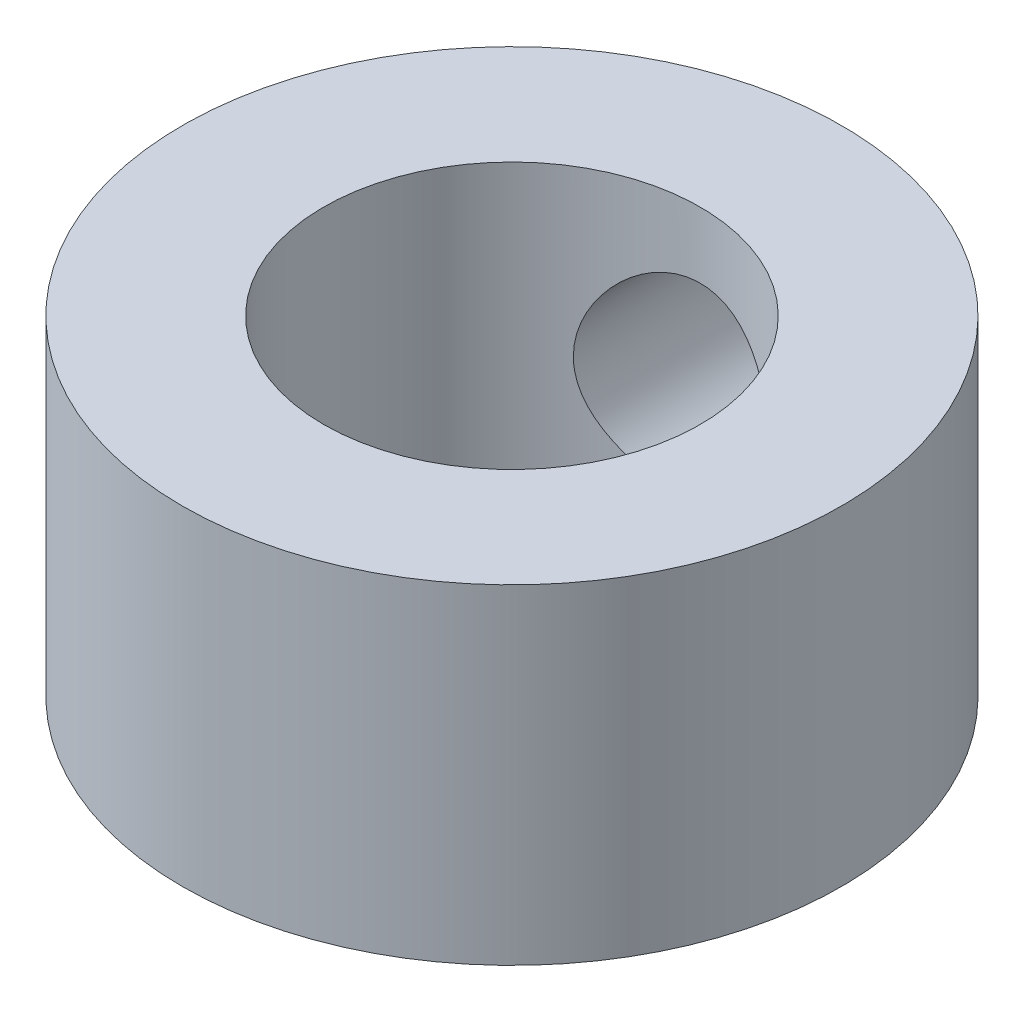
ISO-10303-21;
HEADER;
FILE_DESCRIPTION(('STEP AP214'),'2;1');
FILE_NAME('part.step','',(''),(''),'','','');
FILE_SCHEMA(('AUTOMOTIVE_DESIGN { 1 0 10303 214 1 1 1 1 }'));
ENDSEC;
DATA;
#1=APPLICATION_CONTEXT('core data for automotive mechanical design processes');
#2=APPLICATION_PROTOCOL_DEFINITION('international standard','automotive_design',2000,#1);
#3=PRODUCT_CONTEXT('',#1,'mechanical');
#4=PRODUCT('Part','Part','',(#3));
#5=PRODUCT_RELATED_PRODUCT_CATEGORY('part','',(#4));
#6=PRODUCT_DEFINITION_FORMATION('','',#4);
#7=PRODUCT_DEFINITION_CONTEXT('part definition',#1,'design');
#8=PRODUCT_DEFINITION('design','',#6,#7);
#9=PRODUCT_DEFINITION_SHAPE('','',#8);
#10=(LENGTH_UNIT() NAMED_UNIT(*) SI_UNIT(.MILLI.,.METRE.));
#11=(NAMED_UNIT(*) PLANE_ANGLE_UNIT() SI_UNIT($,.RADIAN.));
#12=(NAMED_UNIT(*) SI_UNIT($,.STERADIAN.) SOLID_ANGLE_UNIT());
#13=UNCERTAINTY_MEASURE_WITH_UNIT(LENGTH_MEASURE(1.E-05),#10,'distance_accuracy_value','');
#14=(GEOMETRIC_REPRESENTATION_CONTEXT(3) GLOBAL_UNCERTAINTY_ASSIGNED_CONTEXT((#13)) GLOBAL_UNIT_ASSIGNED_CONTEXT((#10,
#11,#12)) REPRESENTATION_CONTEXT('',''));
#15=CARTESIAN_POINT('',(0.,0.,0.));
#16=DIRECTION('',(0.,0.,1.));
#17=DIRECTION('',(1.,0.,0.));
#18=AXIS2_PLACEMENT_3D('',#15,#16,#17);
#19=CARTESIAN_POINT('',(0.,7.,0.));
#20=DIRECTION('',(0.,-1.,0.));
#21=DIRECTION('',(0.,0.,-1.));
#22=AXIS2_PLACEMENT_3D('',#19,#20,#21);
#23=CYLINDRICAL_SURFACE('',#22,7.);
#24=CARTESIAN_POINT('',(0.,5.6,-7.));
#25=CARTESIAN_POINT('',(-0.11520405785462,5.59999860352116,-6.9999990095077));
#26=CARTESIAN_POINT('',(-0.230422245692141,5.59048859092645,-6.99712881971535));
#27=CARTESIAN_POINT('',(-0.457503375426833,5.55279010408906,-6.98595947831167));
#28=CARTESIAN_POINT('',(-0.569365306175988,5.52459605876732,-6.97765870745569));
#29=CARTESIAN_POINT('',(-0.786425790856337,5.45055557632563,-6.95653773502571));
#30=CARTESIAN_POINT('',(-0.891633910153522,5.40473518253349,-6.94372420350596));
#31=CARTESIAN_POINT('',(-1.09287385347438,5.29684946972183,-6.91490952932703));
#32=CARTESIAN_POINT('',(-1.18890445445754,5.23478198964642,-6.89890796268893));
#33=CARTESIAN_POINT('',(-1.37182051605724,5.09428638953826,-6.86491032069884));
#34=CARTESIAN_POINT('',(-1.45840529974208,5.01547672375972,-6.84687337119851));
#35=CARTESIAN_POINT('',(-1.61734889292653,4.84454707812574,-6.81108167894619));
#36=CARTESIAN_POINT('',(-1.68970530858417,4.75242486302506,-6.79332698414302));
#37=CARTESIAN_POINT('',(-1.81972052813191,4.55494094574734,-6.75967759591281));
#38=CARTESIAN_POINT('',(-1.87701232631099,4.44932815461297,-6.74383369329425));
#39=CARTESIAN_POINT('',(-1.97289952684665,4.22941504407759,-6.71641068551643));
#40=CARTESIAN_POINT('',(-2.01149941887963,4.11511681850083,-6.70483055638635));
#41=CARTESIAN_POINT('',(-2.06782287155712,3.88445362741736,-6.68767219173808));
#42=CARTESIAN_POINT('',(-2.08610074728548,3.76823615859048,-6.68193497054347));
#43=CARTESIAN_POINT('',(-2.10299222860541,3.53425358129653,-6.67663905649674));
#44=CARTESIAN_POINT('',(-2.1016105986551,3.41648885471728,-6.677078866648));
#45=CARTESIAN_POINT('',(-2.07965768079736,3.18726252794812,-6.68394641694889));
#46=CARTESIAN_POINT('',(-2.05978087367759,3.07572684949287,-6.69015744038797));
#47=CARTESIAN_POINT('',(-2.00252388597878,2.85765229921715,-6.70751698720074));
#48=CARTESIAN_POINT('',(-1.96514197798297,2.75111392167593,-6.71866599785291));
#49=CARTESIAN_POINT('',(-1.87342437315154,2.54435951047496,-6.74481826304962));
#50=CARTESIAN_POINT('',(-1.81886343708499,2.44425008246263,-6.75987222562333));
#51=CARTESIAN_POINT('',(-1.69449311624157,2.25437516918573,-6.7921138180009));
#52=CARTESIAN_POINT('',(-1.62468003603624,2.16461219882071,-6.80930196445787));
#53=CARTESIAN_POINT('',(-1.46833807071765,1.99403933293317,-6.84475415817112));
#54=CARTESIAN_POINT('',(-1.38123287045376,1.91375987035846,-6.86303316034697));
#55=CARTESIAN_POINT('',(-1.19456856303955,1.76882442231005,-6.89797141688562));
#56=CARTESIAN_POINT('',(-1.09500867260524,1.7041694202198,-6.91463056925774));
#57=CARTESIAN_POINT('',(-0.885297053679923,1.59199610854938,-6.94460424097258));
#58=CARTESIAN_POINT('',(-0.775078849647129,1.54459547725019,-6.95789561135639));
#59=CARTESIAN_POINT('',(-0.547743581844925,1.46916057386052,-6.97946930565111));
#60=CARTESIAN_POINT('',(-0.430628452225412,1.44112090005451,-6.98775302661799));
#61=CARTESIAN_POINT('',(-0.197333139735663,1.40608695094085,-6.99815710500954));
#62=CARTESIAN_POINT('',(-0.0812701366416598,1.39837377987775,-7.00048790584906));
#63=CARTESIAN_POINT('',(0.150499448152738,1.40219681799691,-6.99934092538463));
#64=CARTESIAN_POINT('',(0.266206075367095,1.41373045751202,-6.9958639194886));
#65=CARTESIAN_POINT('',(0.491265047433577,1.4551384555561,-6.98362975782027));
#66=CARTESIAN_POINT('',(0.600701881659839,1.48459274261322,-6.9749936171918));
#67=CARTESIAN_POINT('',(0.813056494536333,1.56050052588948,-6.95344086978149));
#68=CARTESIAN_POINT('',(0.915973487835819,1.60695606545301,-6.94052374849531));
#69=CARTESIAN_POINT('',(1.11501206524547,1.71675443167359,-6.91137516091842));
#70=CARTESIAN_POINT('',(1.21092135667954,1.78046307732717,-6.89507393161496));
#71=CARTESIAN_POINT('',(1.39093263117221,1.92251465567393,-6.86102856270093));
#72=CARTESIAN_POINT('',(1.47503164529832,2.00086125664271,-6.84328406203694));
#73=CARTESIAN_POINT('',(1.63220042371437,2.17334223171712,-6.80754440616604));
#74=CARTESIAN_POINT('',(1.70475873724101,2.26794662608056,-6.78956355045859));
#75=CARTESIAN_POINT('',(1.83300593101019,2.46837911461882,-6.75607121334564));
#76=CARTESIAN_POINT('',(1.88869525361276,2.57420691438103,-6.74055966719185));
#77=CARTESIAN_POINT('',(1.98124285978021,2.79374548775703,-6.71394065458417));
#78=CARTESIAN_POINT('',(2.01818885711815,2.90741666115297,-6.7028127297145));
#79=CARTESIAN_POINT('',(2.07230423141214,3.13976315650233,-6.68628232117816));
#80=CARTESIAN_POINT('',(2.08948038570494,3.25843674909625,-6.68087787548571));
#81=CARTESIAN_POINT('',(2.10310778278951,3.49210612574379,-6.67659961459091));
#82=CARTESIAN_POINT('',(2.10039277431121,3.60704911146919,-6.67746306290276));
#83=CARTESIAN_POINT('',(2.07630507622027,3.83475974476086,-6.68499161674532));
#84=CARTESIAN_POINT('',(2.05493313374585,3.94752747925272,-6.69165648995131));
#85=CARTESIAN_POINT('',(1.9946764432608,4.16632355878435,-6.7098606917247));
#86=CARTESIAN_POINT('',(1.95601245709973,4.27241820230217,-6.72133846373454));
#87=CARTESIAN_POINT('',(1.86244109969503,4.47669941434901,-6.74786390463686));
#88=CARTESIAN_POINT('',(1.80753061948006,4.57488446469821,-6.76291225669556));
#89=CARTESIAN_POINT('',(1.68068269327123,4.76442836313677,-6.79556746998737));
#90=CARTESIAN_POINT('',(1.60819786530197,4.85540826576426,-6.81324756230006));
#91=CARTESIAN_POINT('',(1.44924408481689,5.02418349763133,-6.84881848629346));
#92=CARTESIAN_POINT('',(1.36277150398828,5.10197539525495,-6.8667093715328));
#93=CARTESIAN_POINT('',(1.17525206705656,5.24443277721296,-6.90131311199101));
#94=CARTESIAN_POINT('',(1.07385304010685,5.30864802559766,-6.91797623671995));
#95=CARTESIAN_POINT('',(0.861197923576934,5.41902923786566,-6.94764952638087));
#96=CARTESIAN_POINT('',(0.749946474198534,5.46520364358432,-6.9606613990348));
#97=CARTESIAN_POINT('',(0.533060797717393,5.53405338591384,-6.98043044957033));
#98=CARTESIAN_POINT('',(0.428101746735927,5.55871634203655,-6.98770838333498));
#99=CARTESIAN_POINT('',(0.215432273323091,5.59168893533821,-6.99749322292286));
#100=CARTESIAN_POINT('',(0.107722313801395,5.60000130578675,-7.00000092616635));
#101=CARTESIAN_POINT('',(0.,5.6,-7.));
#102=B_SPLINE_CURVE_WITH_KNOTS('',3,(#24,#25,#26,#27,#28,#29,#30,#31,#32,#33,#34,#35,#36,#37,
#38,#39,#40,#41,#42,#43,#44,#45,#46,#47,#48,#49,#50,#51,#52,#53,#54,#55,#56,#57,#58,#59,#60,#61,
#62,#63,#64,#65,#66,#67,#68,#69,#70,#71,#72,#73,#74,#75,#76,#77,#78,#79,#80,#81,#82,#83,#84,#85,
#86,#87,#88,#89,#90,#91,#92,#93,#94,#95,#96,#97,#98,#99,#100,#101),.UNSPECIFIED.,.T.,.F.,(4,2,2,
2,2,2,2,2,2,2,2,2,2,2,2,2,2,2,2,2,2,2,2,2,2,2,2,2,2,2,2,2,2,2,2,2,2,2,4),(0.,0.345216485057655,
0.690535950784399,1.03534714682122,1.38020423017778,1.73397844127468,2.08781212204086,
2.44960073405753,2.81130240360513,3.16287565099238,3.51436369646725,3.85316423376747,
4.19199821121202,4.53547397025967,4.87903304221978,5.23693945667433,5.594868391435,
5.95519465634364,6.31542034940331,6.66272333213963,7.00997994970458,7.34939445355258,
7.6888497643122,8.03615827984072,8.38355394800267,8.74356560451946,9.10356781953753,
9.46186940931753,9.82004813244396,10.1633021765698,10.5065424753262,10.8455205657019,
11.1845635658073,11.5359569595829,11.8874416486289,12.2492019462572,12.6107927623971,
12.9336436870903,13.2564406373481),.UNSPECIFIED.);
#103=CARTESIAN_POINT('',(0.,5.6,-7.));
#104=VERTEX_POINT('',#103);
#105=EDGE_CURVE('E60',#104,#104,#102,.T.);
#106=ORIENTED_EDGE('',*,*,#105,.T.);
#107=EDGE_LOOP('',(#106));
#108=FACE_BOUND('',#107,.T.);
#109=CARTESIAN_POINT('',(0.,7.,0.));
#110=DIRECTION('',(0.,1.,0.));
#111=DIRECTION('',(0.,0.,1.));
#112=AXIS2_PLACEMENT_3D('',#109,#110,#111);
#113=CIRCLE('',#112,7.);
#114=CARTESIAN_POINT('',(0.,7.,7.));
#115=VERTEX_POINT('',#114);
#116=EDGE_CURVE('E10',#115,#115,#113,.T.);
#117=ORIENTED_EDGE('',*,*,#116,.F.);
#118=EDGE_LOOP('',(#117));
#119=FACE_BOUND('',#118,.T.);
#120=CARTESIAN_POINT('',(0.,0.,0.));
#121=DIRECTION('',(0.,1.,0.));
#122=DIRECTION('',(0.,0.,1.));
#123=AXIS2_PLACEMENT_3D('',#120,#121,#122);
#124=CIRCLE('',#123,7.);
#125=CARTESIAN_POINT('',(0.,0.,7.));
#126=VERTEX_POINT('',#125);
#127=EDGE_CURVE('E48',#126,#126,#124,.T.);
#128=ORIENTED_EDGE('',*,*,#127,.T.);
#129=EDGE_LOOP('',(#128));
#130=FACE_BOUND('',#129,.T.);
#131=ADVANCED_FACE('F35',(#108,#119,#130),#23,.T.);
#132=CARTESIAN_POINT('',(0.,7.,0.));
#133=DIRECTION('',(0.,1.,0.));
#134=DIRECTION('',(0.,0.,1.));
#135=AXIS2_PLACEMENT_3D('',#132,#133,#134);
#136=PLANE('',#135);
#137=CARTESIAN_POINT('',(0.,7.,0.));
#138=DIRECTION('',(0.,1.,0.));
#139=DIRECTION('',(0.,0.,1.));
#140=AXIS2_PLACEMENT_3D('',#137,#138,#139);
#141=CIRCLE('',#140,3.99999999999999);
#142=CARTESIAN_POINT('',(0.,7.,3.99999999999999));
#143=VERTEX_POINT('',#142);
#144=EDGE_CURVE('E57',#143,#143,#141,.T.);
#145=ORIENTED_EDGE('',*,*,#144,.F.);
#146=EDGE_LOOP('',(#145));
#147=FACE_BOUND('',#146,.T.);
#148=ORIENTED_EDGE('',*,*,#116,.T.);
#149=EDGE_LOOP('',(#148));
#150=FACE_BOUND('',#149,.T.);
#151=ADVANCED_FACE('F76',(#147,#150),#136,.T.);
#152=CARTESIAN_POINT('',(0.,0.,0.));
#153=DIRECTION('',(0.,1.,0.));
#154=DIRECTION('',(0.,0.,1.));
#155=AXIS2_PLACEMENT_3D('',#152,#153,#154);
#156=PLANE('',#155);
#157=CARTESIAN_POINT('',(0.,0.,0.));
#158=DIRECTION('',(0.,1.,0.));
#159=DIRECTION('',(0.,0.,1.));
#160=AXIS2_PLACEMENT_3D('',#157,#158,#159);
#161=CIRCLE('',#160,3.99999999999999);
#162=CARTESIAN_POINT('',(0.,0.,3.99999999999999));
#163=VERTEX_POINT('',#162);
#164=EDGE_CURVE('E53',#163,#163,#161,.T.);
#165=ORIENTED_EDGE('',*,*,#164,.T.);
#166=EDGE_LOOP('',(#165));
#167=FACE_BOUND('',#166,.T.);
#168=ORIENTED_EDGE('',*,*,#127,.F.);
#169=EDGE_LOOP('',(#168));
#170=FACE_BOUND('',#169,.T.);
#171=ADVANCED_FACE('F74',(#167,#170),#156,.F.);
#172=CARTESIAN_POINT('',(0.,7.,0.));
#173=DIRECTION('',(0.,1.,0.));
#174=DIRECTION('',(0.,0.,1.));
#175=AXIS2_PLACEMENT_3D('',#172,#173,#174);
#176=CYLINDRICAL_SURFACE('',#175,3.99999999999999);
#177=CARTESIAN_POINT('',(-2.1,3.5,-3.40440890610983));
#178=CARTESIAN_POINT('',(-2.09999050444101,3.60854806822367,-3.40442104554004));
#179=CARTESIAN_POINT('',(-2.09152565266831,3.71721793264461,-3.4096816131939));
#180=CARTESIAN_POINT('',(-2.05812746771511,3.93114859577274,-3.42993671516641));
#181=CARTESIAN_POINT('',(-2.03316302064149,4.03640255881997,-3.44494963894295));
#182=CARTESIAN_POINT('',(-1.96818754077056,4.23999628714231,-3.48247368393543));
#183=CARTESIAN_POINT('',(-1.92826307504612,4.33837204007994,-3.50494158243874));
#184=CARTESIAN_POINT('',(-1.83476604408695,4.52699973312681,-3.55477596477235));
#185=CARTESIAN_POINT('',(-1.78119161356656,4.61725056067136,-3.58214311794015));
#186=CARTESIAN_POINT('',(-1.65617796668087,4.79616635533377,-3.64174265017807));
#187=CARTESIAN_POINT('',(-1.58355288547313,4.88393111780774,-3.67419107673055));
#188=CARTESIAN_POINT('',(-1.42495721789503,5.04674576053012,-3.73855922026441));
#189=CARTESIAN_POINT('',(-1.33897940838389,5.12178871270449,-3.77047864067649));
#190=CARTESIAN_POINT('',(-1.14812539766575,5.26264383806501,-3.83309694615304));
#191=CARTESIAN_POINT('',(-1.04230831104118,5.32731670458721,-3.86351743260444));
#192=CARTESIAN_POINT('',(-0.819397840846071,5.43752728229701,-3.91684568589568));
#193=CARTESIAN_POINT('',(-0.702312361188117,5.48307828747706,-3.93975866969711));
#194=CARTESIAN_POINT('',(-0.46975281831707,5.55007898046572,-3.9739226348422));
#195=CARTESIAN_POINT('',(-0.354850970386377,5.5731165746708,-3.98593677549505));
#196=CARTESIAN_POINT('',(-0.122236729297899,5.59969870502837,-3.99982476437112));
#197=CARTESIAN_POINT('',(-0.00452629586049285,5.60325645575545,-4.00170548680471));
#198=CARTESIAN_POINT('',(0.218286964758163,5.59131480141059,-3.99544559335003));
#199=CARTESIAN_POINT('',(0.323518863103069,5.57760552043406,-3.98824623656306));
#200=CARTESIAN_POINT('',(0.529932305927303,5.53476862383927,-3.96609981469188));
#201=CARTESIAN_POINT('',(0.631113543417399,5.50563984198689,-3.95115216357719));
#202=CARTESIAN_POINT('',(0.828194786012936,5.43268735594528,-3.91462313474904));
#203=CARTESIAN_POINT('',(0.924012745587689,5.38868412237964,-3.89296099433149));
#204=CARTESIAN_POINT('',(1.10711690356914,5.2875248428462,-3.84490126586509));
#205=CARTESIAN_POINT('',(1.19440016644139,5.23036429389562,-3.81850205727713));
#206=CARTESIAN_POINT('',(1.36740883412092,5.09788528757077,-3.76023211976589));
#207=CARTESIAN_POINT('',(1.45207960493787,5.02131360539914,-3.72807801907501));
#208=CARTESIAN_POINT('',(1.6079763333584,4.85550020145361,-3.66354275678874));
#209=CARTESIAN_POINT('',(1.67919011953121,4.76624713634861,-3.63116141685205));
#210=CARTESIAN_POINT('',(1.81144564730947,4.56946146269254,-3.56713632829795));
#211=CARTESIAN_POINT('',(1.87132097033769,4.46105924990478,-3.5357308324598));
#212=CARTESIAN_POINT('',(1.97155097773342,4.23373727953742,-3.4808449080426));
#213=CARTESIAN_POINT('',(2.01192745430705,4.11482943991803,-3.45735564108223));
#214=CARTESIAN_POINT('',(2.06858846201758,3.87990435201043,-3.42373399425803));
#215=CARTESIAN_POINT('',(2.08655877306384,3.76443241371402,-3.4126742319302));
#216=CARTESIAN_POINT('',(2.10299357297152,3.53162702524168,-3.40257712834967));
#217=CARTESIAN_POINT('',(2.10147550648786,3.41429533375698,-3.40352903506414));
#218=CARTESIAN_POINT('',(2.08052330760659,3.19699553935114,-3.41636085327599));
#219=CARTESIAN_POINT('',(2.06338039870081,3.09670888305918,-3.42684280465524));
#220=CARTESIAN_POINT('',(2.01519150821212,2.90066895312385,-3.45539892331375));
#221=CARTESIAN_POINT('',(1.98414035221651,2.8049173813832,-3.47347591609061));
#222=CARTESIAN_POINT('',(1.907593902429,2.61570759706068,-3.51611685644972));
#223=CARTESIAN_POINT('',(1.86151088284051,2.52254706192147,-3.54093636897239));
#224=CARTESIAN_POINT('',(1.75670518570757,2.34472874287093,-3.5940837768106));
#225=CARTESIAN_POINT('',(1.69797602782337,2.26007535107099,-3.62241346769678));
#226=CARTESIAN_POINT('',(1.55984278663925,2.0891083432947,-3.6842077830231));
#227=CARTESIAN_POINT('',(1.47868818915007,2.00425973819313,-3.71783113160188));
#228=CARTESIAN_POINT('',(1.30288708365133,1.84886260222561,-3.78302475381136));
#229=CARTESIAN_POINT('',(1.2082344853865,1.77832056142655,-3.81459409126426));
#230=CARTESIAN_POINT('',(1.00344939971044,1.65117905975539,-3.87360910855484));
#231=CARTESIAN_POINT('',(0.892870195953329,1.59520009984348,-3.90085627842943));
#232=CARTESIAN_POINT('',(0.662023324856872,1.50322250009211,-3.94658319150887));
#233=CARTESIAN_POINT('',(0.54176510963577,1.4672046318208,-3.96507136971074));
#234=CARTESIAN_POINT('',(0.30758394025448,1.41955409295113,-3.98972266495783));
#235=CARTESIAN_POINT('',(0.194181782515722,1.40589106080668,-3.99690931122213));
#236=CARTESIAN_POINT('',(-0.0335144503682664,1.39718315692027,-4.00147715273744));
#237=CARTESIAN_POINT('',(-0.147808121250077,1.40213028620441,-3.9988625607343));
#238=CARTESIAN_POINT('',(-0.364707416473475,1.42924861004736,-3.98470802965521));
#239=CARTESIAN_POINT('',(-0.467534399701808,1.4500612681499,-3.97387237515797));
#240=CARTESIAN_POINT('',(-0.668027376143307,1.50636364851209,-3.94512373894052));
#241=CARTESIAN_POINT('',(-0.765692693885539,1.54185528636967,-3.92720983352649));
#242=CARTESIAN_POINT('',(-0.957437676095558,1.62789165525312,-3.88501370070838));
#243=CARTESIAN_POINT('',(-1.05122648340747,1.67897217311821,-3.86050926382013));
#244=CARTESIAN_POINT('',(-1.22925621870694,1.79407465769874,-3.80756733074313));
#245=CARTESIAN_POINT('',(-1.31349290638825,1.85810233699319,-3.77912810019003));
#246=CARTESIAN_POINT('',(-1.47963569338823,2.00524970808313,-3.7174387199694));
#247=CARTESIAN_POINT('',(-1.56031162297637,2.08968347146917,-3.68400044298227));
#248=CARTESIAN_POINT('',(-1.70688136968255,2.27110262957547,-3.61842723354505));
#249=CARTESIAN_POINT('',(-1.77275970510961,2.36810100408183,-3.58629369467188));
#250=CARTESIAN_POINT('',(-1.89076896168727,2.57797963046331,-3.52556747569752));
#251=CARTESIAN_POINT('',(-1.94208814751418,2.69139875299181,-3.49721881749738));
#252=CARTESIAN_POINT('',(-2.00363250452466,2.86805778145464,-3.46208145435585));
#253=CARTESIAN_POINT('',(-2.02156591464839,2.92797718180813,-3.45160588961569));
#254=CARTESIAN_POINT('',(-2.05208115544256,3.04957499092604,-3.43355202789814));
#255=CARTESIAN_POINT('',(-2.06466658269756,3.11125218767007,-3.4259717841297));
#256=CARTESIAN_POINT('',(-2.08293606507223,3.22733615614816,-3.41489033493179));
#257=CARTESIAN_POINT('',(-2.08932503468397,3.28159335594019,-3.41097510186042));
#258=CARTESIAN_POINT('',(-2.09785951023444,3.39055669755778,-3.40573125724305));
#259=CARTESIAN_POINT('',(-2.10000478829074,3.44526286333402,-3.40440278460383));
#260=CARTESIAN_POINT('',(-2.1,3.5,-3.40440890610983));
#261=B_SPLINE_CURVE_WITH_KNOTS('',3,(#177,#178,#179,#180,#181,#182,#183,#184,#185,#186,#187,
#188,#189,#190,#191,#192,#193,#194,#195,#196,#197,#198,#199,#200,#201,#202,#203,#204,#205,#206,
#207,#208,#209,#210,#211,#212,#213,#214,#215,#216,#217,#218,#219,#220,#221,#222,#223,#224,#225,
#226,#227,#228,#229,#230,#231,#232,#233,#234,#235,#236,#237,#238,#239,#240,#241,#242,#243,#244,
#245,#246,#247,#248,#249,#250,#251,#252,#253,#254,#255,#256,#257,#258,#259,#260),.UNSPECIFIED.,
.T.,.F.,(4,2,2,2,2,2,2,2,2,2,2,2,2,2,2,2,2,2,2,2,2,2,2,2,2,2,2,2,2,2,2,2,2,2,2,2,2,2,2,2,2,4),
(0.,0.325421364712881,0.651458146052532,0.975636721057883,1.29985961927413,1.65373988285432,
2.0078122485995,2.38886816483955,2.76965872104551,3.12107987403129,3.4722626032874,
3.78985744244873,4.10747630592009,4.42907437071359,4.75078266387438,5.10509921574281,
5.45973471805833,5.84101781600866,6.22187379431694,6.57189687685821,6.92160666467816,
7.22706767937307,7.53264243204487,7.85198426631367,8.17149013401041,8.53627740119281,
8.9012297830767,9.27983854402029,9.65808195604525,9.99955115658046,10.3408736044351,
10.6558582075278,10.9708839288961,11.2982649092615,11.6257906539085,11.9886241730628,
12.3518355495894,12.732482442984,12.9224733547245,13.1123362922354,13.2764265202851,
13.4405255595938),.UNSPECIFIED.);
#262=CARTESIAN_POINT('',(-2.1,3.5,-3.40440890610983));
#263=VERTEX_POINT('',#262);
#264=EDGE_CURVE('E39',#263,#263,#261,.T.);
#265=ORIENTED_EDGE('',*,*,#264,.T.);
#266=EDGE_LOOP('',(#265));
#267=FACE_BOUND('',#266,.T.);
#268=ORIENTED_EDGE('',*,*,#164,.F.);
#269=EDGE_LOOP('',(#268));
#270=FACE_BOUND('',#269,.T.);
#271=ORIENTED_EDGE('',*,*,#144,.T.);
#272=EDGE_LOOP('',(#271));
#273=FACE_BOUND('',#272,.T.);
#274=ADVANCED_FACE('F68',(#267,#270,#273),#176,.F.);
#275=CARTESIAN_POINT('',(0.,3.5,0.));
#276=DIRECTION('',(0.,0.,-1.));
#277=DIRECTION('',(-1.,0.,0.));
#278=AXIS2_PLACEMENT_3D('',#275,#276,#277);
#279=CYLINDRICAL_SURFACE('',#278,2.1);
#280=ORIENTED_EDGE('',*,*,#264,.F.);
#281=EDGE_LOOP('',(#280));
#282=FACE_BOUND('',#281,.T.);
#283=ORIENTED_EDGE('',*,*,#105,.F.);
#284=EDGE_LOOP('',(#283));
#285=FACE_BOUND('',#284,.T.);
#286=ADVANCED_FACE('F65',(#282,#285),#279,.F.);
#287=CLOSED_SHELL('',(#131,#151,#171,#274,#286));
#288=MANIFOLD_SOLID_BREP('B2',#287);
#289=ADVANCED_BREP_SHAPE_REPRESENTATION('',(#18,#288),#14);
#290=SHAPE_DEFINITION_REPRESENTATION(#9,#289);
ENDSEC;
END-ISO-10303-21;
